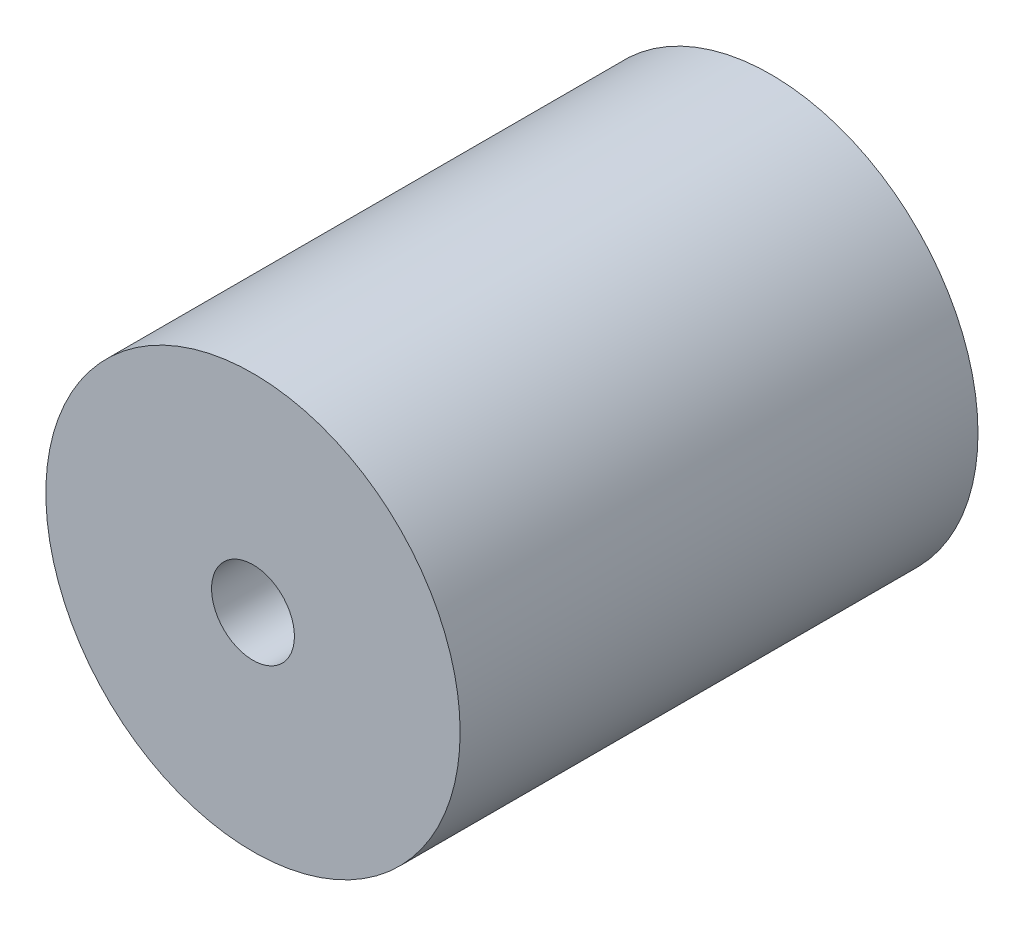
ISO-10303-21;
HEADER;
FILE_DESCRIPTION(('STEP AP214'),'2;1');
FILE_NAME('part.step','',(''),(''),'','','');
FILE_SCHEMA(('AUTOMOTIVE_DESIGN { 1 0 10303 214 1 1 1 1 }'));
ENDSEC;
DATA;
#1=APPLICATION_CONTEXT('core data for automotive mechanical design processes');
#2=APPLICATION_PROTOCOL_DEFINITION('international standard','automotive_design',2000,#1);
#3=PRODUCT_CONTEXT('',#1,'mechanical');
#4=PRODUCT('Part','Part','',(#3));
#5=PRODUCT_RELATED_PRODUCT_CATEGORY('part','',(#4));
#6=PRODUCT_DEFINITION_FORMATION('','',#4);
#7=PRODUCT_DEFINITION_CONTEXT('part definition',#1,'design');
#8=PRODUCT_DEFINITION('design','',#6,#7);
#9=PRODUCT_DEFINITION_SHAPE('','',#8);
#10=(LENGTH_UNIT() NAMED_UNIT(*) SI_UNIT(.MILLI.,.METRE.));
#11=(NAMED_UNIT(*) PLANE_ANGLE_UNIT() SI_UNIT($,.RADIAN.));
#12=(NAMED_UNIT(*) SI_UNIT($,.STERADIAN.) SOLID_ANGLE_UNIT());
#13=UNCERTAINTY_MEASURE_WITH_UNIT(LENGTH_MEASURE(1.E-05),#10,'distance_accuracy_value','');
#14=(GEOMETRIC_REPRESENTATION_CONTEXT(3) GLOBAL_UNCERTAINTY_ASSIGNED_CONTEXT((#13)) GLOBAL_UNIT_ASSIGNED_CONTEXT((#10,
#11,#12)) REPRESENTATION_CONTEXT('',''));
#15=CARTESIAN_POINT('',(0.,0.,0.));
#16=DIRECTION('',(0.,0.,1.));
#17=DIRECTION('',(1.,0.,0.));
#18=AXIS2_PLACEMENT_3D('',#15,#16,#17);
#19=CARTESIAN_POINT('',(0.,0.,25.));
#20=DIRECTION('',(0.,0.,-1.));
#21=DIRECTION('',(-1.,0.,0.));
#22=AXIS2_PLACEMENT_3D('',#19,#20,#21);
#23=CYLINDRICAL_SURFACE('',#22,10.);
#24=CARTESIAN_POINT('',(0.,0.,25.));
#25=DIRECTION('',(0.,0.,1.));
#26=DIRECTION('',(1.,0.,0.));
#27=AXIS2_PLACEMENT_3D('',#24,#25,#26);
#28=CIRCLE('',#27,10.);
#29=CARTESIAN_POINT('',(10.,0.,25.));
#30=VERTEX_POINT('',#29);
#31=EDGE_CURVE('E10',#30,#30,#28,.T.);
#32=ORIENTED_EDGE('',*,*,#31,.F.);
#33=EDGE_LOOP('',(#32));
#34=FACE_BOUND('',#33,.T.);
#35=CARTESIAN_POINT('',(0.,0.,0.));
#36=DIRECTION('',(0.,0.,1.));
#37=DIRECTION('',(1.,0.,0.));
#38=AXIS2_PLACEMENT_3D('',#35,#36,#37);
#39=CIRCLE('',#38,10.);
#40=CARTESIAN_POINT('',(10.,0.,0.));
#41=VERTEX_POINT('',#40);
#42=EDGE_CURVE('E40',#41,#41,#39,.T.);
#43=ORIENTED_EDGE('',*,*,#42,.T.);
#44=EDGE_LOOP('',(#43));
#45=FACE_BOUND('',#44,.T.);
#46=ADVANCED_FACE('F37',(#34,#45),#23,.T.);
#47=CARTESIAN_POINT('',(0.,0.,25.));
#48=DIRECTION('',(0.,0.,1.));
#49=DIRECTION('',(1.,0.,0.));
#50=AXIS2_PLACEMENT_3D('',#47,#48,#49);
#51=PLANE('',#50);
#52=CARTESIAN_POINT('',(0.,0.,25.));
#53=DIRECTION('',(0.,0.,1.));
#54=DIRECTION('',(1.,0.,0.));
#55=AXIS2_PLACEMENT_3D('',#52,#53,#54);
#56=CIRCLE('',#55,2.);
#57=CARTESIAN_POINT('',(2.,0.,25.));
#58=VERTEX_POINT('',#57);
#59=EDGE_CURVE('E52',#58,#58,#56,.T.);
#60=ORIENTED_EDGE('',*,*,#59,.F.);
#61=EDGE_LOOP('',(#60));
#62=FACE_BOUND('',#61,.T.);
#63=ORIENTED_EDGE('',*,*,#31,.T.);
#64=EDGE_LOOP('',(#63));
#65=FACE_BOUND('',#64,.T.);
#66=ADVANCED_FACE('F64',(#62,#65),#51,.T.);
#67=CARTESIAN_POINT('',(0.,0.,0.));
#68=DIRECTION('',(0.,0.,1.));
#69=DIRECTION('',(1.,0.,0.));
#70=AXIS2_PLACEMENT_3D('',#67,#68,#69);
#71=PLANE('',#70);
#72=CARTESIAN_POINT('',(0.,0.,0.));
#73=DIRECTION('',(0.,0.,1.));
#74=DIRECTION('',(1.,0.,0.));
#75=AXIS2_PLACEMENT_3D('',#72,#73,#74);
#76=CIRCLE('',#75,4.);
#77=CARTESIAN_POINT('',(4.,0.,0.));
#78=VERTEX_POINT('',#77);
#79=EDGE_CURVE('E49',#78,#78,#76,.T.);
#80=ORIENTED_EDGE('',*,*,#79,.T.);
#81=EDGE_LOOP('',(#80));
#82=FACE_BOUND('',#81,.T.);
#83=ORIENTED_EDGE('',*,*,#42,.F.);
#84=EDGE_LOOP('',(#83));
#85=FACE_BOUND('',#84,.T.);
#86=ADVANCED_FACE('F66',(#82,#85),#71,.F.);
#87=CARTESIAN_POINT('',(0.,0.,12.));
#88=DIRECTION('',(0.,0.,-1.));
#89=DIRECTION('',(-1.,0.,0.));
#90=AXIS2_PLACEMENT_3D('',#87,#88,#89);
#91=CYLINDRICAL_SURFACE('',#90,4.);
#92=CARTESIAN_POINT('',(0.,0.,12.));
#93=DIRECTION('',(0.,0.,1.));
#94=DIRECTION('',(1.,0.,0.));
#95=AXIS2_PLACEMENT_3D('',#92,#93,#94);
#96=CIRCLE('',#95,4.);
#97=CARTESIAN_POINT('',(4.,0.,12.));
#98=VERTEX_POINT('',#97);
#99=EDGE_CURVE('E47',#98,#98,#96,.T.);
#100=ORIENTED_EDGE('',*,*,#99,.T.);
#101=EDGE_LOOP('',(#100));
#102=FACE_BOUND('',#101,.T.);
#103=ORIENTED_EDGE('',*,*,#79,.F.);
#104=EDGE_LOOP('',(#103));
#105=FACE_BOUND('',#104,.T.);
#106=ADVANCED_FACE('F73',(#102,#105),#91,.F.);
#107=CARTESIAN_POINT('',(0.,0.,12.));
#108=DIRECTION('',(0.,0.,1.));
#109=DIRECTION('',(1.,0.,0.));
#110=AXIS2_PLACEMENT_3D('',#107,#108,#109);
#111=PLANE('',#110);
#112=ORIENTED_EDGE('',*,*,#99,.F.);
#113=EDGE_LOOP('',(#112));
#114=FACE_BOUND('',#113,.T.);
#115=ADVANCED_FACE('F80',(#114),#111,.F.);
#116=CARTESIAN_POINT('',(0.,0.,25.));
#117=DIRECTION('',(0.,0.,-1.));
#118=DIRECTION('',(-1.,0.,0.));
#119=AXIS2_PLACEMENT_3D('',#116,#117,#118);
#120=CYLINDRICAL_SURFACE('',#119,2.);
#121=ORIENTED_EDGE('',*,*,#59,.T.);
#122=EDGE_LOOP('',(#121));
#123=FACE_BOUND('',#122,.T.);
#124=CARTESIAN_POINT('',(0.,0.,15.));
#125=DIRECTION('',(0.,0.,1.));
#126=DIRECTION('',(1.,0.,0.));
#127=AXIS2_PLACEMENT_3D('',#124,#125,#126);
#128=CIRCLE('',#127,2.);
#129=CARTESIAN_POINT('',(2.,0.,15.));
#130=VERTEX_POINT('',#129);
#131=EDGE_CURVE('E55',#130,#130,#128,.T.);
#132=ORIENTED_EDGE('',*,*,#131,.F.);
#133=EDGE_LOOP('',(#132));
#134=FACE_BOUND('',#133,.T.);
#135=ADVANCED_FACE('F61',(#123,#134),#120,.F.);
#136=CARTESIAN_POINT('',(0.,0.,15.));
#137=DIRECTION('',(0.,0.,1.));
#138=DIRECTION('',(1.,0.,0.));
#139=AXIS2_PLACEMENT_3D('',#136,#137,#138);
#140=PLANE('',#139);
#141=ORIENTED_EDGE('',*,*,#131,.T.);
#142=EDGE_LOOP('',(#141));
#143=FACE_BOUND('',#142,.T.);
#144=ADVANCED_FACE('F85',(#143),#140,.T.);
#145=CLOSED_SHELL('',(#46,#66,#86,#106,#115,#135,#144));
#146=MANIFOLD_SOLID_BREP('B2',#145);
#147=ADVANCED_BREP_SHAPE_REPRESENTATION('',(#18,#146),#14);
#148=SHAPE_DEFINITION_REPRESENTATION(#9,#147);
ENDSEC;
END-ISO-10303-21;
